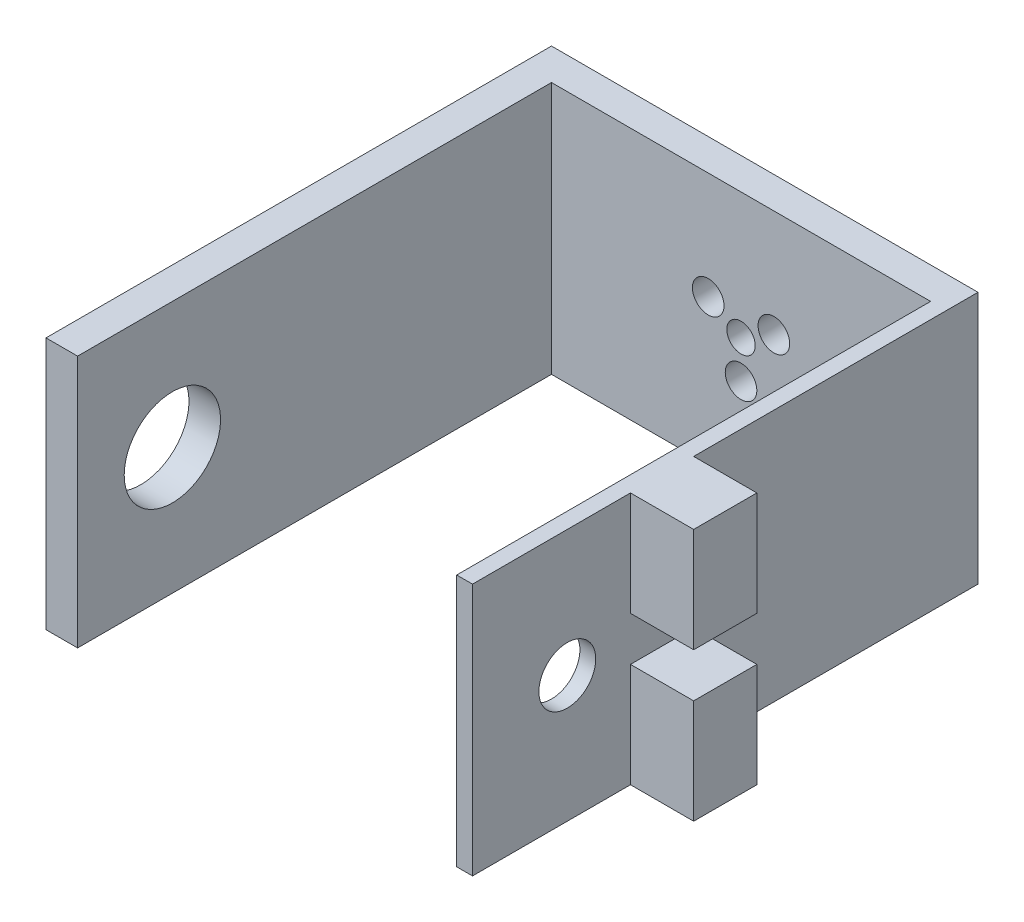
ISO-10303-21;
HEADER;
FILE_DESCRIPTION(('STEP AP214'),'2;1');
FILE_NAME('part.step','',(''),(''),'','','');
FILE_SCHEMA(('AUTOMOTIVE_DESIGN { 1 0 10303 214 1 1 1 1 }'));
ENDSEC;
DATA;
#1=APPLICATION_CONTEXT('core data for automotive mechanical design processes');
#2=APPLICATION_PROTOCOL_DEFINITION('international standard','automotive_design',2000,#1);
#3=PRODUCT_CONTEXT('',#1,'mechanical');
#4=PRODUCT('Part','Part','',(#3));
#5=PRODUCT_RELATED_PRODUCT_CATEGORY('part','',(#4));
#6=PRODUCT_DEFINITION_FORMATION('','',#4);
#7=PRODUCT_DEFINITION_CONTEXT('part definition',#1,'design');
#8=PRODUCT_DEFINITION('design','',#6,#7);
#9=PRODUCT_DEFINITION_SHAPE('','',#8);
#10=(LENGTH_UNIT() NAMED_UNIT(*) SI_UNIT(.MILLI.,.METRE.));
#11=(NAMED_UNIT(*) PLANE_ANGLE_UNIT() SI_UNIT($,.RADIAN.));
#12=(NAMED_UNIT(*) SI_UNIT($,.STERADIAN.) SOLID_ANGLE_UNIT());
#13=UNCERTAINTY_MEASURE_WITH_UNIT(LENGTH_MEASURE(1.E-05),#10,'distance_accuracy_value','');
#14=(GEOMETRIC_REPRESENTATION_CONTEXT(3) GLOBAL_UNCERTAINTY_ASSIGNED_CONTEXT((#13)) GLOBAL_UNIT_ASSIGNED_CONTEXT((#10,
#11,#12)) REPRESENTATION_CONTEXT('',''));
#15=CARTESIAN_POINT('',(0.,0.,0.));
#16=DIRECTION('',(0.,0.,1.));
#17=DIRECTION('',(1.,0.,0.));
#18=AXIS2_PLACEMENT_3D('',#15,#16,#17);
#19=CARTESIAN_POINT('',(32.5,40.,42.2692929036653));
#20=DIRECTION('',(-1.,0.,0.));
#21=DIRECTION('',(0.,0.,1.));
#22=AXIS2_PLACEMENT_3D('',#19,#20,#21);
#23=PLANE('',#22);
#24=CARTESIAN_POINT('',(32.5,20.,27.2692929036653));
#25=DIRECTION('',(1.,0.,0.));
#26=DIRECTION('',(0.,0.,-1.));
#27=AXIS2_PLACEMENT_3D('',#24,#25,#26);
#28=CIRCLE('',#27,4.5);
#29=CARTESIAN_POINT('',(32.5,20.,22.7692929036653));
#30=VERTEX_POINT('',#29);
#31=EDGE_CURVE('E228',#30,#30,#28,.T.);
#32=ORIENTED_EDGE('',*,*,#31,.F.);
#33=EDGE_LOOP('',(#32));
#34=FACE_BOUND('',#33,.T.);
#35=DIRECTION('',(0.,0.,-1.));
#36=VECTOR('',#35,1.);
#37=CARTESIAN_POINT('',(32.5,23.5,0.));
#38=LINE('',#37,#36);
#39=CARTESIAN_POINT('',(32.5,23.5,17.2692929036653));
#40=VERTEX_POINT('',#39);
#41=CARTESIAN_POINT('',(32.5,23.5,7.26929290366533));
#42=VERTEX_POINT('',#41);
#43=EDGE_CURVE('E189',#40,#42,#38,.T.);
#44=ORIENTED_EDGE('',*,*,#43,.F.);
#45=DIRECTION('',(0.,1.,0.));
#46=VECTOR('',#45,1.);
#47=CARTESIAN_POINT('',(32.5,0.,17.2692929036653));
#48=LINE('',#47,#46);
#49=CARTESIAN_POINT('',(32.5,40.,17.2692929036653));
#50=VERTEX_POINT('',#49);
#51=EDGE_CURVE('E171',#40,#50,#48,.T.);
#52=ORIENTED_EDGE('',*,*,#51,.T.);
#53=DIRECTION('',(0.,0.,-1.));
#54=VECTOR('',#53,1.);
#55=CARTESIAN_POINT('',(32.5,40.,42.2692929036653));
#56=LINE('',#55,#54);
#57=CARTESIAN_POINT('',(32.5,40.,42.2692929036653));
#58=VERTEX_POINT('',#57);
#59=EDGE_CURVE('E274',#58,#50,#56,.T.);
#60=ORIENTED_EDGE('',*,*,#59,.F.);
#61=DIRECTION('',(0.,-1.,0.));
#62=VECTOR('',#61,1.);
#63=CARTESIAN_POINT('',(32.5,40.,42.2692929036653));
#64=LINE('',#63,#62);
#65=CARTESIAN_POINT('',(32.5,0.,42.2692929036653));
#66=VERTEX_POINT('',#65);
#67=EDGE_CURVE('E302',#58,#66,#64,.T.);
#68=ORIENTED_EDGE('',*,*,#67,.T.);
#69=DIRECTION('',(0.,0.,-1.));
#70=VECTOR('',#69,1.);
#71=CARTESIAN_POINT('',(32.5,0.,42.2692929036653));
#72=LINE('',#71,#70);
#73=CARTESIAN_POINT('',(32.5,0.,17.2692929036653));
#74=VERTEX_POINT('',#73);
#75=EDGE_CURVE('E293',#66,#74,#72,.T.);
#76=ORIENTED_EDGE('',*,*,#75,.T.);
#77=DIRECTION('',(0.,1.,0.));
#78=VECTOR('',#77,1.);
#79=CARTESIAN_POINT('',(32.5,0.,17.2692929036653));
#80=LINE('',#79,#78);
#81=CARTESIAN_POINT('',(32.5,16.5,17.2692929036653));
#82=VERTEX_POINT('',#81);
#83=EDGE_CURVE('E216',#74,#82,#80,.T.);
#84=ORIENTED_EDGE('',*,*,#83,.T.);
#85=DIRECTION('',(0.,0.,-1.));
#86=VECTOR('',#85,1.);
#87=CARTESIAN_POINT('',(32.5,16.5,0.));
#88=LINE('',#87,#86);
#89=CARTESIAN_POINT('',(32.5,16.5,7.26929290366533));
#90=VERTEX_POINT('',#89);
#91=EDGE_CURVE('E74',#82,#90,#88,.T.);
#92=ORIENTED_EDGE('',*,*,#91,.T.);
#93=DIRECTION('',(0.,1.,0.));
#94=VECTOR('',#93,1.);
#95=CARTESIAN_POINT('',(32.5,0.,7.26929290366533));
#96=LINE('',#95,#94);
#97=CARTESIAN_POINT('',(32.5,0.,7.26929290366533));
#98=VERTEX_POINT('',#97);
#99=EDGE_CURVE('E207',#98,#90,#96,.T.);
#100=ORIENTED_EDGE('',*,*,#99,.F.);
#101=CARTESIAN_POINT('',(32.5,0.,-37.7307070963347));
#102=VERTEX_POINT('',#101);
#103=EDGE_CURVE('E292',#98,#102,#72,.T.);
#104=ORIENTED_EDGE('',*,*,#103,.T.);
#105=DIRECTION('',(0.,-1.,0.));
#106=VECTOR('',#105,1.);
#107=CARTESIAN_POINT('',(32.5,40.,-37.7307070963347));
#108=LINE('',#107,#106);
#109=CARTESIAN_POINT('',(32.5,40.,-37.7307070963347));
#110=VERTEX_POINT('',#109);
#111=EDGE_CURVE('E299',#110,#102,#108,.T.);
#112=ORIENTED_EDGE('',*,*,#111,.F.);
#113=CARTESIAN_POINT('',(32.5,40.,7.26929290366533));
#114=VERTEX_POINT('',#113);
#115=EDGE_CURVE('E273',#114,#110,#56,.T.);
#116=ORIENTED_EDGE('',*,*,#115,.F.);
#117=DIRECTION('',(0.,1.,0.));
#118=VECTOR('',#117,1.);
#119=CARTESIAN_POINT('',(32.5,0.,7.26929290366533));
#120=LINE('',#119,#118);
#121=EDGE_CURVE('E187',#42,#114,#120,.T.);
#122=ORIENTED_EDGE('',*,*,#121,.F.);
#123=EDGE_LOOP('',(#44,#52,#60,#68,#76,#84,#92,#100,#104,#112,#116,#122));
#124=FACE_BOUND('',#123,.T.);
#125=ADVANCED_FACE('F51',(#34,#124),#23,.F.);
#126=CARTESIAN_POINT('',(-35.,40.,42.2692929036653));
#127=DIRECTION('',(1.,0.,0.));
#128=DIRECTION('',(0.,0.,-1.));
#129=AXIS2_PLACEMENT_3D('',#126,#127,#128);
#130=PLANE('',#129);
#131=CARTESIAN_POINT('',(-35.,20.,27.2692929036653));
#132=DIRECTION('',(-1.,0.,0.));
#133=DIRECTION('',(0.,0.,1.));
#134=AXIS2_PLACEMENT_3D('',#131,#132,#133);
#135=CIRCLE('',#134,7.625);
#136=CARTESIAN_POINT('',(-35.,20.,34.8942929036653));
#137=VERTEX_POINT('',#136);
#138=EDGE_CURVE('E234',#137,#137,#135,.T.);
#139=ORIENTED_EDGE('',*,*,#138,.F.);
#140=EDGE_LOOP('',(#139));
#141=FACE_BOUND('',#140,.T.);
#142=DIRECTION('',(0.,0.,1.));
#143=VECTOR('',#142,1.);
#144=CARTESIAN_POINT('',(-35.,0.,42.2692929036653));
#145=LINE('',#144,#143);
#146=CARTESIAN_POINT('',(-35.,0.,-37.7307070963347));
#147=VERTEX_POINT('',#146);
#148=CARTESIAN_POINT('',(-35.,0.,42.2692929036653));
#149=VERTEX_POINT('',#148);
#150=EDGE_CURVE('E258',#147,#149,#145,.T.);
#151=ORIENTED_EDGE('',*,*,#150,.T.);
#152=DIRECTION('',(0.,-1.,0.));
#153=VECTOR('',#152,1.);
#154=CARTESIAN_POINT('',(-35.,40.,42.2692929036653));
#155=LINE('',#154,#153);
#156=CARTESIAN_POINT('',(-35.,40.,42.2692929036653));
#157=VERTEX_POINT('',#156);
#158=EDGE_CURVE('E13',#157,#149,#155,.T.);
#159=ORIENTED_EDGE('',*,*,#158,.F.);
#160=DIRECTION('',(0.,0.,1.));
#161=VECTOR('',#160,1.);
#162=CARTESIAN_POINT('',(-35.,40.,42.2692929036653));
#163=LINE('',#162,#161);
#164=CARTESIAN_POINT('',(-35.,40.,-37.7307070963347));
#165=VERTEX_POINT('',#164);
#166=EDGE_CURVE('E259',#165,#157,#163,.T.);
#167=ORIENTED_EDGE('',*,*,#166,.F.);
#168=DIRECTION('',(0.,-1.,0.));
#169=VECTOR('',#168,1.);
#170=CARTESIAN_POINT('',(-35.,40.,-37.7307070963347));
#171=LINE('',#170,#169);
#172=EDGE_CURVE('E279',#165,#147,#171,.T.);
#173=ORIENTED_EDGE('',*,*,#172,.T.);
#174=EDGE_LOOP('',(#151,#159,#167,#173));
#175=FACE_BOUND('',#174,.T.);
#176=ADVANCED_FACE('F53',(#141,#175),#130,.F.);
#177=CARTESIAN_POINT('',(-35.,40.,42.2692929036653));
#178=DIRECTION('',(0.,0.,-1.));
#179=DIRECTION('',(-1.,0.,0.));
#180=AXIS2_PLACEMENT_3D('',#177,#178,#179);
#181=PLANE('',#180);
#182=DIRECTION('',(1.,0.,0.));
#183=VECTOR('',#182,1.);
#184=CARTESIAN_POINT('',(-35.,0.,42.2692929036653));
#185=LINE('',#184,#183);
#186=CARTESIAN_POINT('',(-30.,0.,42.2692929036653));
#187=VERTEX_POINT('',#186);
#188=EDGE_CURVE('E282',#149,#187,#185,.T.);
#189=ORIENTED_EDGE('',*,*,#188,.T.);
#190=DIRECTION('',(0.,-1.,0.));
#191=VECTOR('',#190,1.);
#192=CARTESIAN_POINT('',(-30.,40.,42.2692929036653));
#193=LINE('',#192,#191);
#194=CARTESIAN_POINT('',(-30.,40.,42.2692929036653));
#195=VERTEX_POINT('',#194);
#196=EDGE_CURVE('E59',#195,#187,#193,.T.);
#197=ORIENTED_EDGE('',*,*,#196,.F.);
#198=DIRECTION('',(1.,0.,0.));
#199=VECTOR('',#198,1.);
#200=CARTESIAN_POINT('',(-35.,40.,42.2692929036653));
#201=LINE('',#200,#199);
#202=EDGE_CURVE('E262',#157,#195,#201,.T.);
#203=ORIENTED_EDGE('',*,*,#202,.F.);
#204=ORIENTED_EDGE('',*,*,#158,.T.);
#205=EDGE_LOOP('',(#189,#197,#203,#204));
#206=FACE_BOUND('',#205,.T.);
#207=ADVANCED_FACE('F340',(#206),#181,.F.);
#208=CARTESIAN_POINT('',(-30.,40.,42.2692929036653));
#209=DIRECTION('',(-1.,0.,0.));
#210=DIRECTION('',(0.,0.,1.));
#211=AXIS2_PLACEMENT_3D('',#208,#209,#210);
#212=PLANE('',#211);
#213=CARTESIAN_POINT('',(-30.,20.,27.2692929036653));
#214=DIRECTION('',(-1.,0.,0.));
#215=DIRECTION('',(0.,0.,1.));
#216=AXIS2_PLACEMENT_3D('',#213,#214,#215);
#217=CIRCLE('',#216,7.625);
#218=CARTESIAN_POINT('',(-30.,20.,34.8942929036653));
#219=VERTEX_POINT('',#218);
#220=EDGE_CURVE('E235',#219,#219,#217,.F.);
#221=ORIENTED_EDGE('',*,*,#220,.F.);
#222=EDGE_LOOP('',(#221));
#223=FACE_BOUND('',#222,.T.);
#224=DIRECTION('',(0.,0.,-1.));
#225=VECTOR('',#224,1.);
#226=CARTESIAN_POINT('',(-30.,0.,42.2692929036653));
#227=LINE('',#226,#225);
#228=CARTESIAN_POINT('',(-30.,0.,-32.7307070963347));
#229=VERTEX_POINT('',#228);
#230=EDGE_CURVE('E284',#187,#229,#227,.T.);
#231=ORIENTED_EDGE('',*,*,#230,.T.);
#232=DIRECTION('',(0.,-1.,0.));
#233=VECTOR('',#232,1.);
#234=CARTESIAN_POINT('',(-30.,40.,-32.7307070963347));
#235=LINE('',#234,#233);
#236=CARTESIAN_POINT('',(-30.,40.,-32.7307070963347));
#237=VERTEX_POINT('',#236);
#238=EDGE_CURVE('E311',#237,#229,#235,.T.);
#239=ORIENTED_EDGE('',*,*,#238,.F.);
#240=DIRECTION('',(0.,0.,-1.));
#241=VECTOR('',#240,1.);
#242=CARTESIAN_POINT('',(-30.,40.,42.2692929036653));
#243=LINE('',#242,#241);
#244=EDGE_CURVE('E265',#195,#237,#243,.T.);
#245=ORIENTED_EDGE('',*,*,#244,.F.);
#246=ORIENTED_EDGE('',*,*,#196,.T.);
#247=EDGE_LOOP('',(#231,#239,#245,#246));
#248=FACE_BOUND('',#247,.T.);
#249=ADVANCED_FACE('F318',(#223,#248),#212,.F.);
#250=CARTESIAN_POINT('',(-30.,40.,-32.7307070963347));
#251=DIRECTION('',(0.,0.,-1.));
#252=DIRECTION('',(-1.,0.,0.));
#253=AXIS2_PLACEMENT_3D('',#250,#251,#252);
#254=PLANE('',#253);
#255=CARTESIAN_POINT('',(-0.00243427689638319,20.0389484303422,-32.7307070963347));
#256=DIRECTION('',(0.,0.,-1.));
#257=DIRECTION('',(-1.,0.,0.));
#258=AXIS2_PLACEMENT_3D('',#255,#256,#257);
#259=CIRCLE('',#258,2.25);
#260=CARTESIAN_POINT('',(-2.25243427689638,20.0389484303422,-32.7307070963347));
#261=VERTEX_POINT('',#260);
#262=EDGE_CURVE('E192',#261,#261,#259,.F.);
#263=ORIENTED_EDGE('',*,*,#262,.F.);
#264=EDGE_LOOP('',(#263));
#265=FACE_BOUND('',#264,.T.);
#266=CARTESIAN_POINT('',(-5.19858669960302,23.0389484303422,-32.7307070963347));
#267=DIRECTION('',(0.,0.,-1.));
#268=DIRECTION('',(-1.,0.,0.));
#269=AXIS2_PLACEMENT_3D('',#266,#267,#268);
#270=CIRCLE('',#269,2.5);
#271=CARTESIAN_POINT('',(-7.69858669960302,23.0389484303422,-32.7307070963347));
#272=VERTEX_POINT('',#271);
#273=EDGE_CURVE('E255',#272,#272,#270,.T.);
#274=ORIENTED_EDGE('',*,*,#273,.T.);
#275=EDGE_LOOP('',(#274));
#276=FACE_BOUND('',#275,.T.);
#277=CARTESIAN_POINT('',(-0.00243427689628648,14.0389484303422,-32.7307070963347));
#278=DIRECTION('',(0.,0.,-1.));
#279=DIRECTION('',(-1.,0.,0.));
#280=AXIS2_PLACEMENT_3D('',#277,#278,#279);
#281=CIRCLE('',#280,2.5);
#282=CARTESIAN_POINT('',(-2.50243427689629,14.0389484303422,-32.7307070963347));
#283=VERTEX_POINT('',#282);
#284=EDGE_CURVE('E252',#283,#283,#281,.T.);
#285=ORIENTED_EDGE('',*,*,#284,.T.);
#286=EDGE_LOOP('',(#285));
#287=FACE_BOUND('',#286,.T.);
#288=CARTESIAN_POINT('',(5.19371814581026,23.0389484303422,-32.7307070963347));
#289=DIRECTION('',(0.,0.,-1.));
#290=DIRECTION('',(-1.,0.,0.));
#291=AXIS2_PLACEMENT_3D('',#288,#289,#290);
#292=CIRCLE('',#291,2.5);
#293=CARTESIAN_POINT('',(2.69371814581025,23.0389484303422,-32.7307070963347));
#294=VERTEX_POINT('',#293);
#295=EDGE_CURVE('E244',#294,#294,#292,.T.);
#296=ORIENTED_EDGE('',*,*,#295,.T.);
#297=EDGE_LOOP('',(#296));
#298=FACE_BOUND('',#297,.T.);
#299=DIRECTION('',(1.,0.,0.));
#300=VECTOR('',#299,1.);
#301=CARTESIAN_POINT('',(-30.,0.,-32.7307070963347));
#302=LINE('',#301,#300);
#303=CARTESIAN_POINT('',(30.,0.,-32.7307070963347));
#304=VERTEX_POINT('',#303);
#305=EDGE_CURVE('E286',#229,#304,#302,.T.);
#306=ORIENTED_EDGE('',*,*,#305,.T.);
#307=DIRECTION('',(0.,-1.,0.));
#308=VECTOR('',#307,1.);
#309=CARTESIAN_POINT('',(30.,40.,-32.7307070963347));
#310=LINE('',#309,#308);
#311=CARTESIAN_POINT('',(30.,40.,-32.7307070963347));
#312=VERTEX_POINT('',#311);
#313=EDGE_CURVE('E308',#312,#304,#310,.T.);
#314=ORIENTED_EDGE('',*,*,#313,.F.);
#315=DIRECTION('',(1.,0.,0.));
#316=VECTOR('',#315,1.);
#317=CARTESIAN_POINT('',(-30.,40.,-32.7307070963347));
#318=LINE('',#317,#316);
#319=EDGE_CURVE('E267',#237,#312,#318,.T.);
#320=ORIENTED_EDGE('',*,*,#319,.F.);
#321=ORIENTED_EDGE('',*,*,#238,.T.);
#322=EDGE_LOOP('',(#306,#314,#320,#321));
#323=FACE_BOUND('',#322,.T.);
#324=ADVANCED_FACE('F329',(#265,#276,#287,#298,#323),#254,.F.);
#325=CARTESIAN_POINT('',(30.,40.,-32.7307070963347));
#326=DIRECTION('',(1.,0.,0.));
#327=DIRECTION('',(0.,0.,-1.));
#328=AXIS2_PLACEMENT_3D('',#325,#326,#327);
#329=PLANE('',#328);
#330=CARTESIAN_POINT('',(30.,20.,27.2692929036653));
#331=DIRECTION('',(1.,0.,0.));
#332=DIRECTION('',(0.,0.,-1.));
#333=AXIS2_PLACEMENT_3D('',#330,#331,#332);
#334=CIRCLE('',#333,4.5);
#335=CARTESIAN_POINT('',(30.,20.,22.7692929036653));
#336=VERTEX_POINT('',#335);
#337=EDGE_CURVE('E231',#336,#336,#334,.T.);
#338=ORIENTED_EDGE('',*,*,#337,.T.);
#339=EDGE_LOOP('',(#338));
#340=FACE_BOUND('',#339,.T.);
#341=DIRECTION('',(0.,0.,1.));
#342=VECTOR('',#341,1.);
#343=CARTESIAN_POINT('',(30.,0.,-32.7307070963347));
#344=LINE('',#343,#342);
#345=CARTESIAN_POINT('',(30.,0.,42.2692929036653));
#346=VERTEX_POINT('',#345);
#347=EDGE_CURVE('E288',#304,#346,#344,.T.);
#348=ORIENTED_EDGE('',*,*,#347,.T.);
#349=DIRECTION('',(0.,-1.,0.));
#350=VECTOR('',#349,1.);
#351=CARTESIAN_POINT('',(30.,40.,42.2692929036653));
#352=LINE('',#351,#350);
#353=CARTESIAN_POINT('',(30.,40.,42.2692929036653));
#354=VERTEX_POINT('',#353);
#355=EDGE_CURVE('E305',#354,#346,#352,.T.);
#356=ORIENTED_EDGE('',*,*,#355,.F.);
#357=DIRECTION('',(0.,0.,1.));
#358=VECTOR('',#357,1.);
#359=CARTESIAN_POINT('',(30.,40.,-32.7307070963347));
#360=LINE('',#359,#358);
#361=EDGE_CURVE('E269',#312,#354,#360,.T.);
#362=ORIENTED_EDGE('',*,*,#361,.F.);
#363=ORIENTED_EDGE('',*,*,#313,.T.);
#364=EDGE_LOOP('',(#348,#356,#362,#363));
#365=FACE_BOUND('',#364,.T.);
#366=ADVANCED_FACE('F333',(#340,#365),#329,.F.);
#367=CARTESIAN_POINT('',(30.,40.,42.2692929036653));
#368=DIRECTION('',(0.,0.,-1.));
#369=DIRECTION('',(-1.,0.,0.));
#370=AXIS2_PLACEMENT_3D('',#367,#368,#369);
#371=PLANE('',#370);
#372=DIRECTION('',(1.,0.,0.));
#373=VECTOR('',#372,1.);
#374=CARTESIAN_POINT('',(30.,0.,42.2692929036653));
#375=LINE('',#374,#373);
#376=EDGE_CURVE('E290',#346,#66,#375,.T.);
#377=ORIENTED_EDGE('',*,*,#376,.T.);
#378=ORIENTED_EDGE('',*,*,#67,.F.);
#379=DIRECTION('',(1.,0.,0.));
#380=VECTOR('',#379,1.);
#381=CARTESIAN_POINT('',(30.,40.,42.2692929036653));
#382=LINE('',#381,#380);
#383=EDGE_CURVE('E271',#354,#58,#382,.T.);
#384=ORIENTED_EDGE('',*,*,#383,.F.);
#385=ORIENTED_EDGE('',*,*,#355,.T.);
#386=EDGE_LOOP('',(#377,#378,#384,#385));
#387=FACE_BOUND('',#386,.T.);
#388=ADVANCED_FACE('F369',(#387),#371,.F.);
#389=CARTESIAN_POINT('',(32.5,40.,-37.7307070963347));
#390=DIRECTION('',(0.,0.,1.));
#391=DIRECTION('',(1.,0.,0.));
#392=AXIS2_PLACEMENT_3D('',#389,#390,#391);
#393=PLANE('',#392);
#394=CARTESIAN_POINT('',(-0.00243427689638375,20.0389484303422,-37.7307070963347));
#395=DIRECTION('',(0.,0.,-1.));
#396=DIRECTION('',(-1.,0.,0.));
#397=AXIS2_PLACEMENT_3D('',#394,#395,#396);
#398=CIRCLE('',#397,2.25);
#399=CARTESIAN_POINT('',(-2.25243427689638,20.0389484303422,-37.7307070963347));
#400=VERTEX_POINT('',#399);
#401=EDGE_CURVE('E651',#400,#400,#398,.T.);
#402=ORIENTED_EDGE('',*,*,#401,.F.);
#403=EDGE_LOOP('',(#402));
#404=FACE_BOUND('',#403,.T.);
#405=CARTESIAN_POINT('',(-5.19858669960302,23.0389484303422,-37.7307070963347));
#406=DIRECTION('',(0.,0.,-1.));
#407=DIRECTION('',(-1.,0.,0.));
#408=AXIS2_PLACEMENT_3D('',#405,#406,#407);
#409=CIRCLE('',#408,2.5);
#410=CARTESIAN_POINT('',(-7.69858669960302,23.0389484303422,-37.7307070963347));
#411=VERTEX_POINT('',#410);
#412=EDGE_CURVE('E241',#411,#411,#409,.T.);
#413=ORIENTED_EDGE('',*,*,#412,.F.);
#414=EDGE_LOOP('',(#413));
#415=FACE_BOUND('',#414,.T.);
#416=CARTESIAN_POINT('',(-0.00243427689628704,14.0389484303422,-37.7307070963347));
#417=DIRECTION('',(0.,0.,-1.));
#418=DIRECTION('',(-1.,0.,0.));
#419=AXIS2_PLACEMENT_3D('',#416,#417,#418);
#420=CIRCLE('',#419,2.5);
#421=CARTESIAN_POINT('',(-2.50243427689629,14.0389484303422,-37.7307070963347));
#422=VERTEX_POINT('',#421);
#423=EDGE_CURVE('E245',#422,#422,#420,.T.);
#424=ORIENTED_EDGE('',*,*,#423,.F.);
#425=EDGE_LOOP('',(#424));
#426=FACE_BOUND('',#425,.T.);
#427=CARTESIAN_POINT('',(5.19371814581026,23.0389484303422,-37.7307070963347));
#428=DIRECTION('',(0.,0.,-1.));
#429=DIRECTION('',(-1.,0.,0.));
#430=AXIS2_PLACEMENT_3D('',#427,#428,#429);
#431=CIRCLE('',#430,2.5);
#432=CARTESIAN_POINT('',(2.69371814581025,23.0389484303422,-37.7307070963347));
#433=VERTEX_POINT('',#432);
#434=EDGE_CURVE('E238',#433,#433,#431,.T.);
#435=ORIENTED_EDGE('',*,*,#434,.F.);
#436=EDGE_LOOP('',(#435));
#437=FACE_BOUND('',#436,.T.);
#438=DIRECTION('',(-1.,0.,0.));
#439=VECTOR('',#438,1.);
#440=CARTESIAN_POINT('',(32.5,0.,-37.7307070963347));
#441=LINE('',#440,#439);
#442=EDGE_CURVE('E263',#102,#147,#441,.T.);
#443=ORIENTED_EDGE('',*,*,#442,.T.);
#444=ORIENTED_EDGE('',*,*,#172,.F.);
#445=DIRECTION('',(-1.,0.,0.));
#446=VECTOR('',#445,1.);
#447=CARTESIAN_POINT('',(32.5,40.,-37.7307070963347));
#448=LINE('',#447,#446);
#449=EDGE_CURVE('E277',#110,#165,#448,.T.);
#450=ORIENTED_EDGE('',*,*,#449,.F.);
#451=ORIENTED_EDGE('',*,*,#111,.T.);
#452=EDGE_LOOP('',(#443,#444,#450,#451));
#453=FACE_BOUND('',#452,.T.);
#454=ADVANCED_FACE('F347',(#404,#415,#426,#437,#453),#393,.F.);
#455=CARTESIAN_POINT('',(0.,40.,0.));
#456=DIRECTION('',(0.,1.,0.));
#457=DIRECTION('',(0.,0.,1.));
#458=AXIS2_PLACEMENT_3D('',#455,#456,#457);
#459=PLANE('',#458);
#460=ORIENTED_EDGE('',*,*,#166,.T.);
#461=ORIENTED_EDGE('',*,*,#202,.T.);
#462=ORIENTED_EDGE('',*,*,#244,.T.);
#463=ORIENTED_EDGE('',*,*,#319,.T.);
#464=ORIENTED_EDGE('',*,*,#361,.T.);
#465=ORIENTED_EDGE('',*,*,#383,.T.);
#466=ORIENTED_EDGE('',*,*,#59,.T.);
#467=DIRECTION('',(-1.,0.,0.));
#468=VECTOR('',#467,1.);
#469=CARTESIAN_POINT('',(42.5,40.,17.2692929036653));
#470=LINE('',#469,#468);
#471=CARTESIAN_POINT('',(42.5,40.,17.2692929036653));
#472=VERTEX_POINT('',#471);
#473=EDGE_CURVE('E197',#472,#50,#470,.T.);
#474=ORIENTED_EDGE('',*,*,#473,.F.);
#475=DIRECTION('',(0.,0.,1.));
#476=VECTOR('',#475,1.);
#477=CARTESIAN_POINT('',(42.5,40.,0.));
#478=LINE('',#477,#476);
#479=CARTESIAN_POINT('',(42.5,40.,7.26929290366533));
#480=VERTEX_POINT('',#479);
#481=EDGE_CURVE('E185',#480,#472,#478,.T.);
#482=ORIENTED_EDGE('',*,*,#481,.F.);
#483=DIRECTION('',(-1.,0.,0.));
#484=VECTOR('',#483,1.);
#485=CARTESIAN_POINT('',(42.5,40.,7.26929290366533));
#486=LINE('',#485,#484);
#487=EDGE_CURVE('E66',#480,#114,#486,.T.);
#488=ORIENTED_EDGE('',*,*,#487,.T.);
#489=ORIENTED_EDGE('',*,*,#115,.T.);
#490=ORIENTED_EDGE('',*,*,#449,.T.);
#491=EDGE_LOOP('',(#460,#461,#462,#463,#464,#465,#466,#474,#482,#488,#489,#490));
#492=FACE_BOUND('',#491,.T.);
#493=ADVANCED_FACE('F336',(#492),#459,.T.);
#494=CARTESIAN_POINT('',(0.,0.,0.));
#495=DIRECTION('',(0.,1.,0.));
#496=DIRECTION('',(0.,0.,1.));
#497=AXIS2_PLACEMENT_3D('',#494,#495,#496);
#498=PLANE('',#497);
#499=ORIENTED_EDGE('',*,*,#150,.F.);
#500=ORIENTED_EDGE('',*,*,#442,.F.);
#501=ORIENTED_EDGE('',*,*,#103,.F.);
#502=DIRECTION('',(-1.,0.,0.));
#503=VECTOR('',#502,1.);
#504=CARTESIAN_POINT('',(42.5,0.,7.26929290366533));
#505=LINE('',#504,#503);
#506=CARTESIAN_POINT('',(42.5,0.,7.26929290366533));
#507=VERTEX_POINT('',#506);
#508=EDGE_CURVE('E222',#507,#98,#505,.T.);
#509=ORIENTED_EDGE('',*,*,#508,.F.);
#510=DIRECTION('',(0.,0.,-1.));
#511=VECTOR('',#510,1.);
#512=CARTESIAN_POINT('',(42.5,0.,0.));
#513=LINE('',#512,#511);
#514=CARTESIAN_POINT('',(42.5,0.,17.2692929036653));
#515=VERTEX_POINT('',#514);
#516=EDGE_CURVE('E210',#515,#507,#513,.T.);
#517=ORIENTED_EDGE('',*,*,#516,.F.);
#518=DIRECTION('',(-1.,0.,0.));
#519=VECTOR('',#518,1.);
#520=CARTESIAN_POINT('',(42.5,0.,17.2692929036653));
#521=LINE('',#520,#519);
#522=EDGE_CURVE('E224',#515,#74,#521,.T.);
#523=ORIENTED_EDGE('',*,*,#522,.T.);
#524=ORIENTED_EDGE('',*,*,#75,.F.);
#525=ORIENTED_EDGE('',*,*,#376,.F.);
#526=ORIENTED_EDGE('',*,*,#347,.F.);
#527=ORIENTED_EDGE('',*,*,#305,.F.);
#528=ORIENTED_EDGE('',*,*,#230,.F.);
#529=ORIENTED_EDGE('',*,*,#188,.F.);
#530=EDGE_LOOP('',(#499,#500,#501,#509,#517,#523,#524,#525,#526,#527,#528,#529));
#531=FACE_BOUND('',#530,.T.);
#532=ADVANCED_FACE('F324',(#531),#498,.F.);
#533=CARTESIAN_POINT('',(5.19371814581026,23.0389484303422,42.2692929036653));
#534=DIRECTION('',(0.,0.,-1.));
#535=DIRECTION('',(-1.,0.,0.));
#536=AXIS2_PLACEMENT_3D('',#533,#534,#535);
#537=CYLINDRICAL_SURFACE('',#536,2.5);
#538=ORIENTED_EDGE('',*,*,#434,.T.);
#539=EDGE_LOOP('',(#538));
#540=FACE_BOUND('',#539,.T.);
#541=ORIENTED_EDGE('',*,*,#295,.F.);
#542=EDGE_LOOP('',(#541));
#543=FACE_BOUND('',#542,.T.);
#544=ADVANCED_FACE('F446',(#540,#543),#537,.F.);
#545=CARTESIAN_POINT('',(-0.00243427689627808,14.0389484303422,42.2692929036653));
#546=DIRECTION('',(0.,0.,-1.));
#547=DIRECTION('',(-1.,0.,0.));
#548=AXIS2_PLACEMENT_3D('',#545,#546,#547);
#549=CYLINDRICAL_SURFACE('',#548,2.5);
#550=ORIENTED_EDGE('',*,*,#423,.T.);
#551=EDGE_LOOP('',(#550));
#552=FACE_BOUND('',#551,.T.);
#553=ORIENTED_EDGE('',*,*,#284,.F.);
#554=EDGE_LOOP('',(#553));
#555=FACE_BOUND('',#554,.T.);
#556=ADVANCED_FACE('F452',(#552,#555),#549,.F.);
#557=CARTESIAN_POINT('',(-5.19858669960301,23.0389484303422,42.2692929036653));
#558=DIRECTION('',(0.,0.,-1.));
#559=DIRECTION('',(-1.,0.,0.));
#560=AXIS2_PLACEMENT_3D('',#557,#558,#559);
#561=CYLINDRICAL_SURFACE('',#560,2.5);
#562=ORIENTED_EDGE('',*,*,#412,.T.);
#563=EDGE_LOOP('',(#562));
#564=FACE_BOUND('',#563,.T.);
#565=ORIENTED_EDGE('',*,*,#273,.F.);
#566=EDGE_LOOP('',(#565));
#567=FACE_BOUND('',#566,.T.);
#568=ADVANCED_FACE('F460',(#564,#567),#561,.F.);
#569=CARTESIAN_POINT('',(32.501,20.,27.2692929036653));
#570=DIRECTION('',(-1.,0.,0.));
#571=DIRECTION('',(0.,0.,1.));
#572=AXIS2_PLACEMENT_3D('',#569,#570,#571);
#573=CYLINDRICAL_SURFACE('',#572,7.625);
#574=ORIENTED_EDGE('',*,*,#138,.T.);
#575=EDGE_LOOP('',(#574));
#576=FACE_BOUND('',#575,.T.);
#577=ORIENTED_EDGE('',*,*,#220,.T.);
#578=EDGE_LOOP('',(#577));
#579=FACE_BOUND('',#578,.T.);
#580=ADVANCED_FACE('F468',(#576,#579),#573,.F.);
#581=CARTESIAN_POINT('',(22.5,20.,27.2692929036653));
#582=DIRECTION('',(1.,0.,0.));
#583=DIRECTION('',(0.,0.,-1.));
#584=AXIS2_PLACEMENT_3D('',#581,#582,#583);
#585=CYLINDRICAL_SURFACE('',#584,4.5);
#586=ORIENTED_EDGE('',*,*,#31,.T.);
#587=EDGE_LOOP('',(#586));
#588=FACE_BOUND('',#587,.T.);
#589=ORIENTED_EDGE('',*,*,#337,.F.);
#590=EDGE_LOOP('',(#589));
#591=FACE_BOUND('',#590,.T.);
#592=ADVANCED_FACE('F475',(#588,#591),#585,.F.);
#593=CARTESIAN_POINT('',(42.5,16.5,0.));
#594=DIRECTION('',(0.,1.,0.));
#595=DIRECTION('',(0.,0.,1.));
#596=AXIS2_PLACEMENT_3D('',#593,#594,#595);
#597=PLANE('',#596);
#598=ORIENTED_EDGE('',*,*,#91,.F.);
#599=DIRECTION('',(-1.,0.,0.));
#600=VECTOR('',#599,1.);
#601=CARTESIAN_POINT('',(42.5,16.5,17.2692929036653));
#602=LINE('',#601,#600);
#603=CARTESIAN_POINT('',(42.5,16.5,17.2692929036653));
#604=VERTEX_POINT('',#603);
#605=EDGE_CURVE('E226',#604,#82,#602,.T.);
#606=ORIENTED_EDGE('',*,*,#605,.F.);
#607=DIRECTION('',(0.,0.,-1.));
#608=VECTOR('',#607,1.);
#609=CARTESIAN_POINT('',(42.5,16.5,0.));
#610=LINE('',#609,#608);
#611=CARTESIAN_POINT('',(42.5,16.5,7.26929290366533));
#612=VERTEX_POINT('',#611);
#613=EDGE_CURVE('E203',#604,#612,#610,.T.);
#614=ORIENTED_EDGE('',*,*,#613,.T.);
#615=DIRECTION('',(-1.,0.,0.));
#616=VECTOR('',#615,1.);
#617=CARTESIAN_POINT('',(42.5,16.5,7.26929290366533));
#618=LINE('',#617,#616);
#619=EDGE_CURVE('E214',#612,#90,#618,.T.);
#620=ORIENTED_EDGE('',*,*,#619,.T.);
#621=EDGE_LOOP('',(#598,#606,#614,#620));
#622=FACE_BOUND('',#621,.T.);
#623=ADVANCED_FACE('F482',(#622),#597,.T.);
#624=CARTESIAN_POINT('',(42.5,0.,17.2692929036653));
#625=DIRECTION('',(0.,0.,1.));
#626=DIRECTION('',(1.,0.,0.));
#627=AXIS2_PLACEMENT_3D('',#624,#625,#626);
#628=PLANE('',#627);
#629=ORIENTED_EDGE('',*,*,#83,.F.);
#630=ORIENTED_EDGE('',*,*,#522,.F.);
#631=DIRECTION('',(0.,1.,0.));
#632=VECTOR('',#631,1.);
#633=CARTESIAN_POINT('',(42.5,0.,17.2692929036653));
#634=LINE('',#633,#632);
#635=EDGE_CURVE('E206',#515,#604,#634,.T.);
#636=ORIENTED_EDGE('',*,*,#635,.T.);
#637=ORIENTED_EDGE('',*,*,#605,.T.);
#638=EDGE_LOOP('',(#629,#630,#636,#637));
#639=FACE_BOUND('',#638,.T.);
#640=ADVANCED_FACE('F366',(#639),#628,.T.);
#641=CARTESIAN_POINT('',(42.5,0.,7.26929290366533));
#642=DIRECTION('',(0.,0.,1.));
#643=DIRECTION('',(1.,0.,0.));
#644=AXIS2_PLACEMENT_3D('',#641,#642,#643);
#645=PLANE('',#644);
#646=ORIENTED_EDGE('',*,*,#99,.T.);
#647=ORIENTED_EDGE('',*,*,#619,.F.);
#648=DIRECTION('',(0.,1.,0.));
#649=VECTOR('',#648,1.);
#650=CARTESIAN_POINT('',(42.5,0.,7.26929290366533));
#651=LINE('',#650,#649);
#652=EDGE_CURVE('E212',#507,#612,#651,.T.);
#653=ORIENTED_EDGE('',*,*,#652,.F.);
#654=ORIENTED_EDGE('',*,*,#508,.T.);
#655=EDGE_LOOP('',(#646,#647,#653,#654));
#656=FACE_BOUND('',#655,.T.);
#657=ADVANCED_FACE('F356',(#656),#645,.F.);
#658=CARTESIAN_POINT('',(42.5,0.,0.));
#659=DIRECTION('',(1.,0.,0.));
#660=DIRECTION('',(0.,0.,-1.));
#661=AXIS2_PLACEMENT_3D('',#658,#659,#660);
#662=PLANE('',#661);
#663=ORIENTED_EDGE('',*,*,#613,.F.);
#664=ORIENTED_EDGE('',*,*,#635,.F.);
#665=ORIENTED_EDGE('',*,*,#516,.T.);
#666=ORIENTED_EDGE('',*,*,#652,.T.);
#667=EDGE_LOOP('',(#663,#664,#665,#666));
#668=FACE_BOUND('',#667,.T.);
#669=ADVANCED_FACE('F364',(#668),#662,.T.);
#670=CARTESIAN_POINT('',(42.5,0.,17.2692929036653));
#671=DIRECTION('',(0.,0.,1.));
#672=DIRECTION('',(1.,0.,0.));
#673=AXIS2_PLACEMENT_3D('',#670,#671,#672);
#674=PLANE('',#673);
#675=ORIENTED_EDGE('',*,*,#51,.F.);
#676=DIRECTION('',(-1.,0.,0.));
#677=VECTOR('',#676,1.);
#678=CARTESIAN_POINT('',(42.5,23.5,17.2692929036653));
#679=LINE('',#678,#677);
#680=CARTESIAN_POINT('',(42.5,23.5,17.2692929036653));
#681=VERTEX_POINT('',#680);
#682=EDGE_CURVE('E165',#681,#40,#679,.T.);
#683=ORIENTED_EDGE('',*,*,#682,.F.);
#684=DIRECTION('',(0.,1.,0.));
#685=VECTOR('',#684,1.);
#686=CARTESIAN_POINT('',(42.5,0.,17.2692929036653));
#687=LINE('',#686,#685);
#688=EDGE_CURVE('E169',#681,#472,#687,.T.);
#689=ORIENTED_EDGE('',*,*,#688,.T.);
#690=ORIENTED_EDGE('',*,*,#473,.T.);
#691=EDGE_LOOP('',(#675,#683,#689,#690));
#692=FACE_BOUND('',#691,.T.);
#693=ADVANCED_FACE('F167',(#692),#674,.T.);
#694=CARTESIAN_POINT('',(42.5,23.5,0.));
#695=DIRECTION('',(0.,1.,0.));
#696=DIRECTION('',(0.,0.,1.));
#697=AXIS2_PLACEMENT_3D('',#694,#695,#696);
#698=PLANE('',#697);
#699=ORIENTED_EDGE('',*,*,#43,.T.);
#700=DIRECTION('',(-1.,0.,0.));
#701=VECTOR('',#700,1.);
#702=CARTESIAN_POINT('',(42.5,23.5,7.26929290366533));
#703=LINE('',#702,#701);
#704=CARTESIAN_POINT('',(42.5,23.5,7.26929290366533));
#705=VERTEX_POINT('',#704);
#706=EDGE_CURVE('E174',#705,#42,#703,.T.);
#707=ORIENTED_EDGE('',*,*,#706,.F.);
#708=DIRECTION('',(0.,0.,-1.));
#709=VECTOR('',#708,1.);
#710=CARTESIAN_POINT('',(42.5,23.5,0.));
#711=LINE('',#710,#709);
#712=EDGE_CURVE('E177',#681,#705,#711,.T.);
#713=ORIENTED_EDGE('',*,*,#712,.F.);
#714=ORIENTED_EDGE('',*,*,#682,.T.);
#715=EDGE_LOOP('',(#699,#707,#713,#714));
#716=FACE_BOUND('',#715,.T.);
#717=ADVANCED_FACE('F178',(#716),#698,.F.);
#718=CARTESIAN_POINT('',(42.5,0.,7.26929290366533));
#719=DIRECTION('',(0.,0.,1.));
#720=DIRECTION('',(1.,0.,0.));
#721=AXIS2_PLACEMENT_3D('',#718,#719,#720);
#722=PLANE('',#721);
#723=ORIENTED_EDGE('',*,*,#121,.T.);
#724=ORIENTED_EDGE('',*,*,#487,.F.);
#725=DIRECTION('',(0.,1.,0.));
#726=VECTOR('',#725,1.);
#727=CARTESIAN_POINT('',(42.5,0.,7.26929290366533));
#728=LINE('',#727,#726);
#729=EDGE_CURVE('E182',#705,#480,#728,.T.);
#730=ORIENTED_EDGE('',*,*,#729,.F.);
#731=ORIENTED_EDGE('',*,*,#706,.T.);
#732=EDGE_LOOP('',(#723,#724,#730,#731));
#733=FACE_BOUND('',#732,.T.);
#734=ADVANCED_FACE('F371',(#733),#722,.F.);
#735=CARTESIAN_POINT('',(42.5,0.,0.));
#736=DIRECTION('',(1.,0.,0.));
#737=DIRECTION('',(0.,0.,-1.));
#738=AXIS2_PLACEMENT_3D('',#735,#736,#737);
#739=PLANE('',#738);
#740=ORIENTED_EDGE('',*,*,#688,.F.);
#741=ORIENTED_EDGE('',*,*,#712,.T.);
#742=ORIENTED_EDGE('',*,*,#729,.T.);
#743=ORIENTED_EDGE('',*,*,#481,.T.);
#744=EDGE_LOOP('',(#740,#741,#742,#743));
#745=FACE_BOUND('',#744,.T.);
#746=ADVANCED_FACE('F184',(#745),#739,.T.);
#747=CARTESIAN_POINT('',(-0.00243427689637479,20.0389484303422,42.2702929036653));
#748=DIRECTION('',(0.,0.,-1.));
#749=DIRECTION('',(-1.,0.,0.));
#750=AXIS2_PLACEMENT_3D('',#747,#748,#749);
#751=CYLINDRICAL_SURFACE('',#750,2.25);
#752=ORIENTED_EDGE('',*,*,#401,.T.);
#753=EDGE_LOOP('',(#752));
#754=FACE_BOUND('',#753,.T.);
#755=ORIENTED_EDGE('',*,*,#262,.T.);
#756=EDGE_LOOP('',(#755));
#757=FACE_BOUND('',#756,.T.);
#758=ADVANCED_FACE('F378',(#754,#757),#751,.F.);
#759=CLOSED_SHELL('',(#125,#176,#207,#249,#324,#366,#388,#454,#493,#532,#544,#556,#568,#580,
#592,#623,#640,#657,#669,#693,#717,#734,#746,#758));
#760=MANIFOLD_SOLID_BREP('B2',#759);
#761=ADVANCED_BREP_SHAPE_REPRESENTATION('',(#18,#760),#14);
#762=SHAPE_DEFINITION_REPRESENTATION(#9,#761);
ENDSEC;
END-ISO-10303-21;
